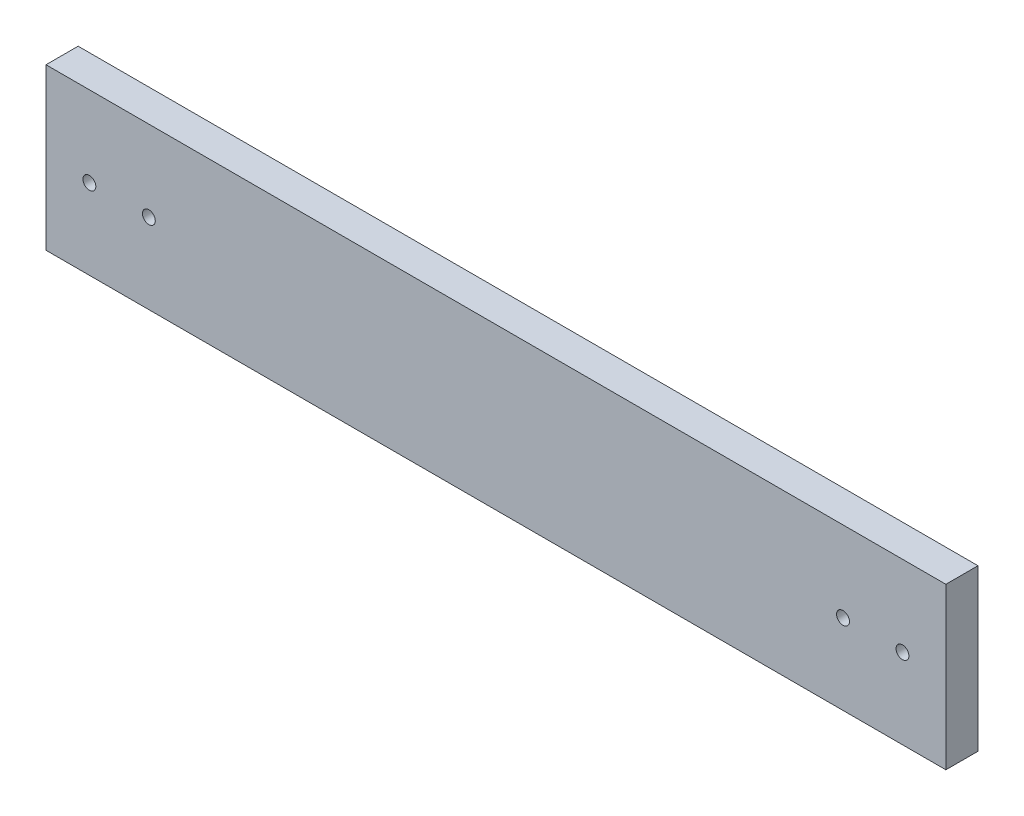
ISO-10303-21;
HEADER;
FILE_DESCRIPTION(('STEP AP214'),'2;1');
FILE_NAME('part.step','',(''),(''),'','','');
FILE_SCHEMA(('AUTOMOTIVE_DESIGN { 1 0 10303 214 1 1 1 1 }'));
ENDSEC;
DATA;
#1=APPLICATION_CONTEXT('core data for automotive mechanical design processes');
#2=APPLICATION_PROTOCOL_DEFINITION('international standard','automotive_design',2000,#1);
#3=PRODUCT_CONTEXT('',#1,'mechanical');
#4=PRODUCT('Part','Part','',(#3));
#5=PRODUCT_RELATED_PRODUCT_CATEGORY('part','',(#4));
#6=PRODUCT_DEFINITION_FORMATION('','',#4);
#7=PRODUCT_DEFINITION_CONTEXT('part definition',#1,'design');
#8=PRODUCT_DEFINITION('design','',#6,#7);
#9=PRODUCT_DEFINITION_SHAPE('','',#8);
#10=(LENGTH_UNIT() NAMED_UNIT(*) SI_UNIT(.MILLI.,.METRE.));
#11=(NAMED_UNIT(*) PLANE_ANGLE_UNIT() SI_UNIT($,.RADIAN.));
#12=(NAMED_UNIT(*) SI_UNIT($,.STERADIAN.) SOLID_ANGLE_UNIT());
#13=UNCERTAINTY_MEASURE_WITH_UNIT(LENGTH_MEASURE(1.E-05),#10,'distance_accuracy_value','');
#14=(GEOMETRIC_REPRESENTATION_CONTEXT(3) GLOBAL_UNCERTAINTY_ASSIGNED_CONTEXT((#13)) GLOBAL_UNIT_ASSIGNED_CONTEXT((#10,
#11,#12)) REPRESENTATION_CONTEXT('',''));
#15=CARTESIAN_POINT('',(0.,0.,0.));
#16=DIRECTION('',(0.,0.,1.));
#17=DIRECTION('',(1.,0.,0.));
#18=AXIS2_PLACEMENT_3D('',#15,#16,#17);
#19=CARTESIAN_POINT('',(0.,0.,10.));
#20=DIRECTION('',(-1.,0.,0.));
#21=DIRECTION('',(0.,-1.,0.));
#22=AXIS2_PLACEMENT_3D('',#19,#20,#21);
#23=PLANE('',#22);
#24=DIRECTION('',(0.,1.,0.));
#25=VECTOR('',#24,1.);
#26=CARTESIAN_POINT('',(0.,0.,0.));
#27=LINE('',#26,#25);
#28=CARTESIAN_POINT('',(0.,0.,0.));
#29=VERTEX_POINT('',#28);
#30=CARTESIAN_POINT('',(0.,50.,0.));
#31=VERTEX_POINT('',#30);
#32=EDGE_CURVE('E99',#29,#31,#27,.T.);
#33=ORIENTED_EDGE('',*,*,#32,.T.);
#34=DIRECTION('',(0.,0.,-1.));
#35=VECTOR('',#34,1.);
#36=CARTESIAN_POINT('',(0.,50.,10.));
#37=LINE('',#36,#35);
#38=CARTESIAN_POINT('',(0.,50.,10.));
#39=VERTEX_POINT('',#38);
#40=EDGE_CURVE('E11',#39,#31,#37,.T.);
#41=ORIENTED_EDGE('',*,*,#40,.F.);
#42=DIRECTION('',(0.,1.,0.));
#43=VECTOR('',#42,1.);
#44=CARTESIAN_POINT('',(0.,0.,10.));
#45=LINE('',#44,#43);
#46=CARTESIAN_POINT('',(0.,0.,10.));
#47=VERTEX_POINT('',#46);
#48=EDGE_CURVE('E87',#47,#39,#45,.T.);
#49=ORIENTED_EDGE('',*,*,#48,.F.);
#50=DIRECTION('',(0.,0.,-1.));
#51=VECTOR('',#50,1.);
#52=CARTESIAN_POINT('',(0.,0.,10.));
#53=LINE('',#52,#51);
#54=EDGE_CURVE('E95',#47,#29,#53,.T.);
#55=ORIENTED_EDGE('',*,*,#54,.T.);
#56=EDGE_LOOP('',(#33,#41,#49,#55));
#57=FACE_BOUND('',#56,.T.);
#58=ADVANCED_FACE('F36',(#57),#23,.F.);
#59=CARTESIAN_POINT('',(0.,50.,10.));
#60=DIRECTION('',(0.,-1.,0.));
#61=DIRECTION('',(1.,0.,0.));
#62=AXIS2_PLACEMENT_3D('',#59,#60,#61);
#63=PLANE('',#62);
#64=DIRECTION('',(-1.,0.,0.));
#65=VECTOR('',#64,1.);
#66=CARTESIAN_POINT('',(0.,50.,0.));
#67=LINE('',#66,#65);
#68=CARTESIAN_POINT('',(-280.,50.,0.));
#69=VERTEX_POINT('',#68);
#70=EDGE_CURVE('E91',#31,#69,#67,.T.);
#71=ORIENTED_EDGE('',*,*,#70,.T.);
#72=DIRECTION('',(0.,0.,-1.));
#73=VECTOR('',#72,1.);
#74=CARTESIAN_POINT('',(-280.,50.,10.));
#75=LINE('',#74,#73);
#76=CARTESIAN_POINT('',(-280.,50.,10.));
#77=VERTEX_POINT('',#76);
#78=EDGE_CURVE('E44',#77,#69,#75,.T.);
#79=ORIENTED_EDGE('',*,*,#78,.F.);
#80=DIRECTION('',(-1.,0.,0.));
#81=VECTOR('',#80,1.);
#82=CARTESIAN_POINT('',(0.,50.,10.));
#83=LINE('',#82,#81);
#84=EDGE_CURVE('E82',#39,#77,#83,.T.);
#85=ORIENTED_EDGE('',*,*,#84,.F.);
#86=ORIENTED_EDGE('',*,*,#40,.T.);
#87=EDGE_LOOP('',(#71,#79,#85,#86));
#88=FACE_BOUND('',#87,.T.);
#89=ADVANCED_FACE('F90',(#88),#63,.F.);
#90=CARTESIAN_POINT('',(-280.,0.,10.));
#91=DIRECTION('',(1.,0.,0.));
#92=DIRECTION('',(0.,0.,-1.));
#93=AXIS2_PLACEMENT_3D('',#90,#91,#92);
#94=PLANE('',#93);
#95=DIRECTION('',(0.,-1.,0.));
#96=VECTOR('',#95,1.);
#97=CARTESIAN_POINT('',(-280.,0.,0.));
#98=LINE('',#97,#96);
#99=CARTESIAN_POINT('',(-280.,0.,0.));
#100=VERTEX_POINT('',#99);
#101=EDGE_CURVE('E69',#69,#100,#98,.T.);
#102=ORIENTED_EDGE('',*,*,#101,.T.);
#103=DIRECTION('',(0.,0.,-1.));
#104=VECTOR('',#103,1.);
#105=CARTESIAN_POINT('',(-280.,0.,10.));
#106=LINE('',#105,#104);
#107=CARTESIAN_POINT('',(-280.,0.,10.));
#108=VERTEX_POINT('',#107);
#109=EDGE_CURVE('E92',#108,#100,#106,.T.);
#110=ORIENTED_EDGE('',*,*,#109,.F.);
#111=DIRECTION('',(0.,-1.,0.));
#112=VECTOR('',#111,1.);
#113=CARTESIAN_POINT('',(-280.,0.,10.));
#114=LINE('',#113,#112);
#115=EDGE_CURVE('E85',#77,#108,#114,.T.);
#116=ORIENTED_EDGE('',*,*,#115,.F.);
#117=ORIENTED_EDGE('',*,*,#78,.T.);
#118=EDGE_LOOP('',(#102,#110,#116,#117));
#119=FACE_BOUND('',#118,.T.);
#120=ADVANCED_FACE('F93',(#119),#94,.F.);
#121=CARTESIAN_POINT('',(0.,0.,10.));
#122=DIRECTION('',(0.,1.,0.));
#123=DIRECTION('',(-1.,0.,0.));
#124=AXIS2_PLACEMENT_3D('',#121,#122,#123);
#125=PLANE('',#124);
#126=DIRECTION('',(1.,0.,0.));
#127=VECTOR('',#126,1.);
#128=CARTESIAN_POINT('',(0.,0.,0.));
#129=LINE('',#128,#127);
#130=EDGE_CURVE('E75',#100,#29,#129,.T.);
#131=ORIENTED_EDGE('',*,*,#130,.T.);
#132=ORIENTED_EDGE('',*,*,#54,.F.);
#133=DIRECTION('',(1.,0.,0.));
#134=VECTOR('',#133,1.);
#135=CARTESIAN_POINT('',(0.,0.,10.));
#136=LINE('',#135,#134);
#137=EDGE_CURVE('E52',#108,#47,#136,.T.);
#138=ORIENTED_EDGE('',*,*,#137,.F.);
#139=ORIENTED_EDGE('',*,*,#109,.T.);
#140=EDGE_LOOP('',(#131,#132,#138,#139));
#141=FACE_BOUND('',#140,.T.);
#142=ADVANCED_FACE('F107',(#141),#125,.F.);
#143=CARTESIAN_POINT('',(0.,0.,10.));
#144=DIRECTION('',(0.,0.,1.));
#145=DIRECTION('',(1.,0.,0.));
#146=AXIS2_PLACEMENT_3D('',#143,#144,#145);
#147=PLANE('',#146);
#148=CARTESIAN_POINT('',(-266.5,24.9336942218761,10.));
#149=DIRECTION('',(0.,0.,-1.));
#150=DIRECTION('',(-1.,0.,0.));
#151=AXIS2_PLACEMENT_3D('',#148,#149,#150);
#152=CIRCLE('',#151,2.);
#153=CARTESIAN_POINT('',(-268.5,24.9336942218761,10.));
#154=VERTEX_POINT('',#153);
#155=EDGE_CURVE('E126',#154,#154,#152,.T.);
#156=ORIENTED_EDGE('',*,*,#155,.T.);
#157=EDGE_LOOP('',(#156));
#158=FACE_BOUND('',#157,.T.);
#159=CARTESIAN_POINT('',(-13.5,24.9336942218761,10.));
#160=DIRECTION('',(0.,0.,-1.));
#161=DIRECTION('',(-1.,0.,0.));
#162=AXIS2_PLACEMENT_3D('',#159,#160,#161);
#163=CIRCLE('',#162,2.);
#164=CARTESIAN_POINT('',(-15.5,24.9336942218761,10.));
#165=VERTEX_POINT('',#164);
#166=EDGE_CURVE('E119',#165,#165,#163,.T.);
#167=ORIENTED_EDGE('',*,*,#166,.T.);
#168=EDGE_LOOP('',(#167));
#169=FACE_BOUND('',#168,.T.);
#170=CARTESIAN_POINT('',(-32.,24.9336942218761,10.));
#171=DIRECTION('',(0.,0.,-1.));
#172=DIRECTION('',(-1.,0.,0.));
#173=AXIS2_PLACEMENT_3D('',#170,#171,#172);
#174=CIRCLE('',#173,2.);
#175=CARTESIAN_POINT('',(-34.,24.9336942218761,10.));
#176=VERTEX_POINT('',#175);
#177=EDGE_CURVE('E131',#176,#176,#174,.T.);
#178=ORIENTED_EDGE('',*,*,#177,.T.);
#179=EDGE_LOOP('',(#178));
#180=FACE_BOUND('',#179,.T.);
#181=CARTESIAN_POINT('',(-248.,24.9336942218761,10.));
#182=DIRECTION('',(0.,0.,-1.));
#183=DIRECTION('',(-1.,0.,0.));
#184=AXIS2_PLACEMENT_3D('',#181,#182,#183);
#185=CIRCLE('',#184,1.99999999999997);
#186=CARTESIAN_POINT('',(-250.,24.9336942218761,10.));
#187=VERTEX_POINT('',#186);
#188=EDGE_CURVE('E102',#187,#187,#185,.T.);
#189=ORIENTED_EDGE('',*,*,#188,.T.);
#190=EDGE_LOOP('',(#189));
#191=FACE_BOUND('',#190,.T.);
#192=ORIENTED_EDGE('',*,*,#48,.T.);
#193=ORIENTED_EDGE('',*,*,#84,.T.);
#194=ORIENTED_EDGE('',*,*,#115,.T.);
#195=ORIENTED_EDGE('',*,*,#137,.T.);
#196=EDGE_LOOP('',(#192,#193,#194,#195));
#197=FACE_BOUND('',#196,.T.);
#198=ADVANCED_FACE('F83',(#158,#169,#180,#191,#197),#147,.T.);
#199=CARTESIAN_POINT('',(0.,0.,0.));
#200=DIRECTION('',(0.,0.,1.));
#201=DIRECTION('',(1.,0.,0.));
#202=AXIS2_PLACEMENT_3D('',#199,#200,#201);
#203=PLANE('',#202);
#204=CARTESIAN_POINT('',(-266.5,24.9336942218761,0.));
#205=DIRECTION('',(0.,0.,-1.));
#206=DIRECTION('',(-1.,0.,0.));
#207=AXIS2_PLACEMENT_3D('',#204,#205,#206);
#208=CIRCLE('',#207,2.);
#209=CARTESIAN_POINT('',(-268.5,24.9336942218761,0.));
#210=VERTEX_POINT('',#209);
#211=EDGE_CURVE('E116',#210,#210,#208,.T.);
#212=ORIENTED_EDGE('',*,*,#211,.F.);
#213=EDGE_LOOP('',(#212));
#214=FACE_BOUND('',#213,.T.);
#215=CARTESIAN_POINT('',(-13.5,24.9336942218761,0.));
#216=DIRECTION('',(0.,0.,-1.));
#217=DIRECTION('',(-1.,0.,0.));
#218=AXIS2_PLACEMENT_3D('',#215,#216,#217);
#219=CIRCLE('',#218,2.);
#220=CARTESIAN_POINT('',(-15.5,24.9336942218761,0.));
#221=VERTEX_POINT('',#220);
#222=EDGE_CURVE('E122',#221,#221,#219,.T.);
#223=ORIENTED_EDGE('',*,*,#222,.F.);
#224=EDGE_LOOP('',(#223));
#225=FACE_BOUND('',#224,.T.);
#226=CARTESIAN_POINT('',(-32.,24.9336942218761,0.));
#227=DIRECTION('',(0.,0.,-1.));
#228=DIRECTION('',(-1.,0.,0.));
#229=AXIS2_PLACEMENT_3D('',#226,#227,#228);
#230=CIRCLE('',#229,2.);
#231=CARTESIAN_POINT('',(-34.,24.9336942218761,0.));
#232=VERTEX_POINT('',#231);
#233=EDGE_CURVE('E123',#232,#232,#230,.T.);
#234=ORIENTED_EDGE('',*,*,#233,.F.);
#235=EDGE_LOOP('',(#234));
#236=FACE_BOUND('',#235,.T.);
#237=CARTESIAN_POINT('',(-248.,24.9336942218761,0.));
#238=DIRECTION('',(0.,0.,-1.));
#239=DIRECTION('',(-1.,0.,0.));
#240=AXIS2_PLACEMENT_3D('',#237,#238,#239);
#241=CIRCLE('',#240,1.99999999999997);
#242=CARTESIAN_POINT('',(-250.,24.9336942218761,0.));
#243=VERTEX_POINT('',#242);
#244=EDGE_CURVE('E113',#243,#243,#241,.T.);
#245=ORIENTED_EDGE('',*,*,#244,.F.);
#246=EDGE_LOOP('',(#245));
#247=FACE_BOUND('',#246,.T.);
#248=ORIENTED_EDGE('',*,*,#32,.F.);
#249=ORIENTED_EDGE('',*,*,#130,.F.);
#250=ORIENTED_EDGE('',*,*,#101,.F.);
#251=ORIENTED_EDGE('',*,*,#70,.F.);
#252=EDGE_LOOP('',(#248,#249,#250,#251));
#253=FACE_BOUND('',#252,.T.);
#254=ADVANCED_FACE('F110',(#214,#225,#236,#247,#253),#203,.F.);
#255=CARTESIAN_POINT('',(-248.,24.9336942218761,10.));
#256=DIRECTION('',(0.,0.,-1.));
#257=DIRECTION('',(-1.,0.,0.));
#258=AXIS2_PLACEMENT_3D('',#255,#256,#257);
#259=CYLINDRICAL_SURFACE('',#258,1.99999999999997);
#260=ORIENTED_EDGE('',*,*,#188,.F.);
#261=EDGE_LOOP('',(#260));
#262=FACE_BOUND('',#261,.T.);
#263=ORIENTED_EDGE('',*,*,#244,.T.);
#264=EDGE_LOOP('',(#263));
#265=FACE_BOUND('',#264,.T.);
#266=ADVANCED_FACE('F141',(#262,#265),#259,.F.);
#267=CARTESIAN_POINT('',(-32.,24.9336942218761,10.));
#268=DIRECTION('',(0.,0.,-1.));
#269=DIRECTION('',(-1.,0.,0.));
#270=AXIS2_PLACEMENT_3D('',#267,#268,#269);
#271=CYLINDRICAL_SURFACE('',#270,2.);
#272=ORIENTED_EDGE('',*,*,#177,.F.);
#273=EDGE_LOOP('',(#272));
#274=FACE_BOUND('',#273,.T.);
#275=ORIENTED_EDGE('',*,*,#233,.T.);
#276=EDGE_LOOP('',(#275));
#277=FACE_BOUND('',#276,.T.);
#278=ADVANCED_FACE('F137',(#274,#277),#271,.F.);
#279=CARTESIAN_POINT('',(-13.5,24.9336942218761,10.));
#280=DIRECTION('',(0.,0.,-1.));
#281=DIRECTION('',(-1.,0.,0.));
#282=AXIS2_PLACEMENT_3D('',#279,#280,#281);
#283=CYLINDRICAL_SURFACE('',#282,2.);
#284=ORIENTED_EDGE('',*,*,#166,.F.);
#285=EDGE_LOOP('',(#284));
#286=FACE_BOUND('',#285,.T.);
#287=ORIENTED_EDGE('',*,*,#222,.T.);
#288=EDGE_LOOP('',(#287));
#289=FACE_BOUND('',#288,.T.);
#290=ADVANCED_FACE('F152',(#286,#289),#283,.F.);
#291=CARTESIAN_POINT('',(-266.5,24.9336942218761,10.));
#292=DIRECTION('',(0.,0.,-1.));
#293=DIRECTION('',(-1.,0.,0.));
#294=AXIS2_PLACEMENT_3D('',#291,#292,#293);
#295=CYLINDRICAL_SURFACE('',#294,2.);
#296=ORIENTED_EDGE('',*,*,#155,.F.);
#297=EDGE_LOOP('',(#296));
#298=FACE_BOUND('',#297,.T.);
#299=ORIENTED_EDGE('',*,*,#211,.T.);
#300=EDGE_LOOP('',(#299));
#301=FACE_BOUND('',#300,.T.);
#302=ADVANCED_FACE('F181',(#298,#301),#295,.F.);
#303=CLOSED_SHELL('',(#58,#89,#120,#142,#198,#254,#266,#278,#290,#302));
#304=MANIFOLD_SOLID_BREP('B2',#303);
#305=ADVANCED_BREP_SHAPE_REPRESENTATION('',(#18,#304),#14);
#306=SHAPE_DEFINITION_REPRESENTATION(#9,#305);
ENDSEC;
END-ISO-10303-21;
